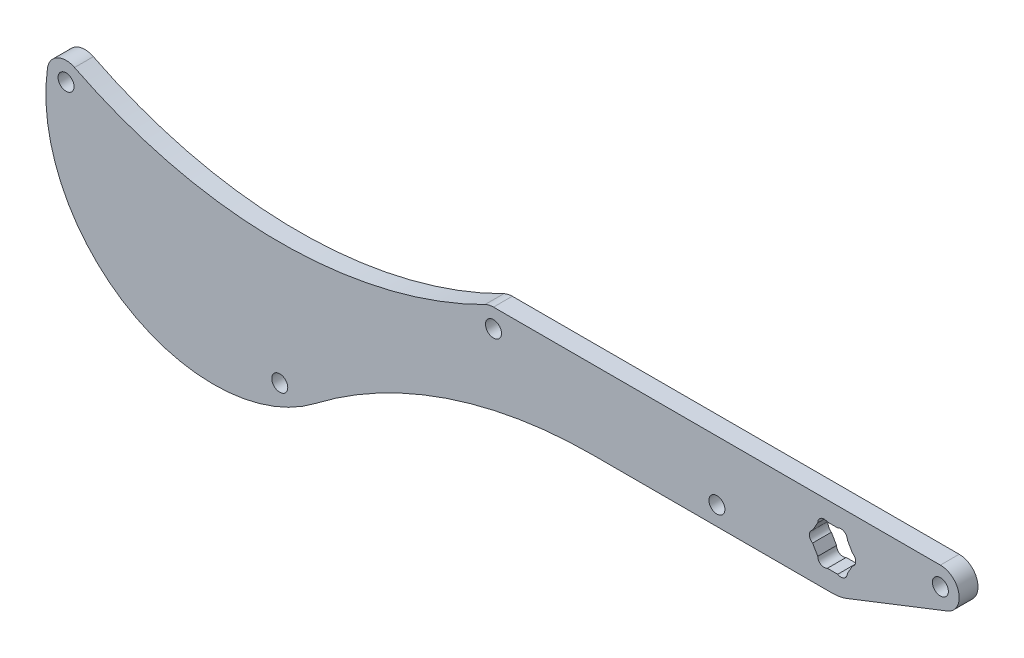
ISO-10303-21;
HEADER;
FILE_DESCRIPTION(('STEP AP214'),'2;1');
FILE_NAME('part.step','',(''),(''),'','','');
FILE_SCHEMA(('AUTOMOTIVE_DESIGN { 1 0 10303 214 1 1 1 1 }'));
ENDSEC;
DATA;
#1=APPLICATION_CONTEXT('core data for automotive mechanical design processes');
#2=APPLICATION_PROTOCOL_DEFINITION('international standard','automotive_design',2000,#1);
#3=PRODUCT_CONTEXT('',#1,'mechanical');
#4=PRODUCT('Part','Part','',(#3));
#5=PRODUCT_RELATED_PRODUCT_CATEGORY('part','',(#4));
#6=PRODUCT_DEFINITION_FORMATION('','',#4);
#7=PRODUCT_DEFINITION_CONTEXT('part definition',#1,'design');
#8=PRODUCT_DEFINITION('design','',#6,#7);
#9=PRODUCT_DEFINITION_SHAPE('','',#8);
#10=(LENGTH_UNIT() NAMED_UNIT(*) SI_UNIT(.MILLI.,.METRE.));
#11=(NAMED_UNIT(*) PLANE_ANGLE_UNIT() SI_UNIT($,.RADIAN.));
#12=(NAMED_UNIT(*) SI_UNIT($,.STERADIAN.) SOLID_ANGLE_UNIT());
#13=UNCERTAINTY_MEASURE_WITH_UNIT(LENGTH_MEASURE(1.E-05),#10,'distance_accuracy_value','');
#14=(GEOMETRIC_REPRESENTATION_CONTEXT(3) GLOBAL_UNCERTAINTY_ASSIGNED_CONTEXT((#13)) GLOBAL_UNIT_ASSIGNED_CONTEXT((#10,
#11,#12)) REPRESENTATION_CONTEXT('',''));
#15=CARTESIAN_POINT('',(0.,0.,0.));
#16=DIRECTION('',(0.,0.,1.));
#17=DIRECTION('',(1.,0.,0.));
#18=AXIS2_PLACEMENT_3D('',#15,#16,#17);
#19=CARTESIAN_POINT('',(231.79092816411,6.49999999999999,13.5));
#20=DIRECTION('',(0.,0.,1.));
#21=DIRECTION('',(1.,0.,0.));
#22=AXIS2_PLACEMENT_3D('',#19,#20,#21);
#23=CYLINDRICAL_SURFACE('',#22,5.99999999999998);
#24=CARTESIAN_POINT('',(231.79092816411,6.49999999999999,19.5));
#25=DIRECTION('',(0.,0.,1.));
#26=DIRECTION('',(1.,0.,0.));
#27=AXIS2_PLACEMENT_3D('',#24,#25,#26);
#28=CIRCLE('',#27,5.99999999999998);
#29=CARTESIAN_POINT('',(233.980730891528,0.913877551020409,19.5));
#30=VERTEX_POINT('',#29);
#31=CARTESIAN_POINT('',(231.79092816411,12.5,19.5));
#32=VERTEX_POINT('',#31);
#33=EDGE_CURVE('E320',#30,#32,#28,.T.);
#34=ORIENTED_EDGE('',*,*,#33,.F.);
#35=DIRECTION('',(0.,0.,1.));
#36=VECTOR('',#35,1.);
#37=CARTESIAN_POINT('',(233.980730891528,0.913877551020409,13.5));
#38=LINE('',#37,#36);
#39=CARTESIAN_POINT('',(233.980730891528,0.913877551020409,13.5));
#40=VERTEX_POINT('',#39);
#41=EDGE_CURVE('E42',#40,#30,#38,.T.);
#42=ORIENTED_EDGE('',*,*,#41,.F.);
#43=CARTESIAN_POINT('',(231.79092816411,6.49999999999999,13.5));
#44=DIRECTION('',(0.,0.,1.));
#45=DIRECTION('',(1.,0.,0.));
#46=AXIS2_PLACEMENT_3D('',#43,#44,#45);
#47=CIRCLE('',#46,5.99999999999998);
#48=CARTESIAN_POINT('',(231.79092816411,12.5,13.5));
#49=VERTEX_POINT('',#48);
#50=EDGE_CURVE('E344',#40,#49,#47,.T.);
#51=ORIENTED_EDGE('',*,*,#50,.T.);
#52=DIRECTION('',(0.,0.,1.));
#53=VECTOR('',#52,1.);
#54=CARTESIAN_POINT('',(231.79092816411,12.5,13.5));
#55=LINE('',#54,#53);
#56=EDGE_CURVE('E11',#49,#32,#55,.T.);
#57=ORIENTED_EDGE('',*,*,#56,.T.);
#58=EDGE_LOOP('',(#34,#42,#51,#57));
#59=FACE_BOUND('',#58,.T.);
#60=ADVANCED_FACE('F33',(#59),#23,.T.);
#61=CARTESIAN_POINT('',(201.961884601529,-11.6377551020408,13.5));
#62=DIRECTION('',(0.364967121236293,-0.931020408163265,0.));
#63=DIRECTION('',(0.931020408163265,0.364967121236293,0.));
#64=AXIS2_PLACEMENT_3D('',#61,#62,#63);
#65=PLANE('',#64);
#66=DIRECTION('',(0.931020408163265,0.364967121236293,0.));
#67=VECTOR('',#66,1.);
#68=CARTESIAN_POINT('',(201.961884601529,-11.6377551020408,19.5));
#69=LINE('',#68,#67);
#70=CARTESIAN_POINT('',(201.961884601529,-11.6377551020408,19.5));
#71=VERTEX_POINT('',#70);
#72=EDGE_CURVE('E370',#71,#30,#69,.T.);
#73=ORIENTED_EDGE('',*,*,#72,.F.);
#74=DIRECTION('',(0.,0.,1.));
#75=VECTOR('',#74,1.);
#76=CARTESIAN_POINT('',(201.961884601529,-11.6377551020408,13.5));
#77=LINE('',#76,#75);
#78=CARTESIAN_POINT('',(201.961884601529,-11.6377551020408,13.5));
#79=VERTEX_POINT('',#78);
#80=EDGE_CURVE('E376',#79,#71,#77,.T.);
#81=ORIENTED_EDGE('',*,*,#80,.F.);
#82=DIRECTION('',(0.931020408163265,0.364967121236293,0.));
#83=VECTOR('',#82,1.);
#84=CARTESIAN_POINT('',(201.961884601529,-11.6377551020408,13.5));
#85=LINE('',#84,#83);
#86=EDGE_CURVE('E341',#79,#40,#85,.T.);
#87=ORIENTED_EDGE('',*,*,#86,.T.);
#88=ORIENTED_EDGE('',*,*,#41,.T.);
#89=EDGE_LOOP('',(#73,#81,#87,#88));
#90=FACE_BOUND('',#89,.T.);
#91=ADVANCED_FACE('F428',(#90),#65,.T.);
#92=CARTESIAN_POINT('',(197.399795586075,0.,13.5));
#93=DIRECTION('',(0.,0.,1.));
#94=DIRECTION('',(1.,0.,0.));
#95=AXIS2_PLACEMENT_3D('',#92,#93,#94);
#96=CYLINDRICAL_SURFACE('',#95,12.5);
#97=CARTESIAN_POINT('',(197.399795586075,0.,19.5));
#98=DIRECTION('',(0.,0.,1.));
#99=DIRECTION('',(1.,0.,0.));
#100=AXIS2_PLACEMENT_3D('',#97,#98,#99);
#101=CIRCLE('',#100,12.5);
#102=CARTESIAN_POINT('',(197.399795586075,-12.5,19.5));
#103=VERTEX_POINT('',#102);
#104=EDGE_CURVE('E367',#103,#71,#101,.T.);
#105=ORIENTED_EDGE('',*,*,#104,.F.);
#106=DIRECTION('',(0.,0.,1.));
#107=VECTOR('',#106,1.);
#108=CARTESIAN_POINT('',(197.399795586075,-12.5,13.5));
#109=LINE('',#108,#107);
#110=CARTESIAN_POINT('',(197.399795586075,-12.5,13.5));
#111=VERTEX_POINT('',#110);
#112=EDGE_CURVE('E378',#111,#103,#109,.T.);
#113=ORIENTED_EDGE('',*,*,#112,.F.);
#114=CARTESIAN_POINT('',(197.399795586075,0.,13.5));
#115=DIRECTION('',(0.,0.,1.));
#116=DIRECTION('',(1.,0.,0.));
#117=AXIS2_PLACEMENT_3D('',#114,#115,#116);
#118=CIRCLE('',#117,12.5);
#119=EDGE_CURVE('E338',#111,#79,#118,.T.);
#120=ORIENTED_EDGE('',*,*,#119,.T.);
#121=ORIENTED_EDGE('',*,*,#80,.T.);
#122=EDGE_LOOP('',(#105,#113,#120,#121));
#123=FACE_BOUND('',#122,.T.);
#124=ADVANCED_FACE('F426',(#123),#96,.T.);
#125=CARTESIAN_POINT('',(120.978886955537,-12.5,13.5));
#126=DIRECTION('',(0.,-1.,0.));
#127=DIRECTION('',(1.,0.,0.));
#128=AXIS2_PLACEMENT_3D('',#125,#126,#127);
#129=PLANE('',#128);
#130=DIRECTION('',(1.,0.,0.));
#131=VECTOR('',#130,1.);
#132=CARTESIAN_POINT('',(120.978886955537,-12.5,19.5));
#133=LINE('',#132,#131);
#134=CARTESIAN_POINT('',(120.978886955537,-12.5,19.5));
#135=VERTEX_POINT('',#134);
#136=EDGE_CURVE('E364',#135,#103,#133,.T.);
#137=ORIENTED_EDGE('',*,*,#136,.F.);
#138=DIRECTION('',(0.,0.,1.));
#139=VECTOR('',#138,1.);
#140=CARTESIAN_POINT('',(120.978886955537,-12.5,13.5));
#141=LINE('',#140,#139);
#142=CARTESIAN_POINT('',(120.978886955537,-12.5,13.5));
#143=VERTEX_POINT('',#142);
#144=EDGE_CURVE('E380',#143,#135,#141,.T.);
#145=ORIENTED_EDGE('',*,*,#144,.F.);
#146=DIRECTION('',(1.,0.,0.));
#147=VECTOR('',#146,1.);
#148=CARTESIAN_POINT('',(120.978886955537,-12.5,13.5));
#149=LINE('',#148,#147);
#150=EDGE_CURVE('E335',#143,#111,#149,.T.);
#151=ORIENTED_EDGE('',*,*,#150,.T.);
#152=ORIENTED_EDGE('',*,*,#112,.T.);
#153=EDGE_LOOP('',(#137,#145,#151,#152));
#154=FACE_BOUND('',#153,.T.);
#155=ADVANCED_FACE('F422',(#154),#129,.T.);
#156=CARTESIAN_POINT('',(120.978886955537,-157.986476695129,13.5));
#157=DIRECTION('',(0.,0.,1.));
#158=DIRECTION('',(1.,0.,0.));
#159=AXIS2_PLACEMENT_3D('',#156,#157,#158);
#160=CYLINDRICAL_SURFACE('',#159,145.486476695129);
#161=CARTESIAN_POINT('',(120.978886955537,-157.986476695129,19.5));
#162=DIRECTION('',(0.,0.,-1.));
#163=DIRECTION('',(1.,0.,0.));
#164=AXIS2_PLACEMENT_3D('',#161,#162,#163);
#165=CIRCLE('',#164,145.486476695129);
#166=CARTESIAN_POINT('',(32.5266850271321,-42.4766378277017,19.5));
#167=VERTEX_POINT('',#166);
#168=EDGE_CURVE('E361',#167,#135,#165,.T.);
#169=ORIENTED_EDGE('',*,*,#168,.F.);
#170=DIRECTION('',(0.,0.,1.));
#171=VECTOR('',#170,1.);
#172=CARTESIAN_POINT('',(32.5266850271321,-42.4766378277017,13.5));
#173=LINE('',#172,#171);
#174=CARTESIAN_POINT('',(32.5266850271321,-42.4766378277017,13.5));
#175=VERTEX_POINT('',#174);
#176=EDGE_CURVE('E382',#175,#167,#173,.T.);
#177=ORIENTED_EDGE('',*,*,#176,.F.);
#178=CARTESIAN_POINT('',(120.978886955537,-157.986476695129,13.5));
#179=DIRECTION('',(0.,0.,-1.));
#180=DIRECTION('',(1.,0.,0.));
#181=AXIS2_PLACEMENT_3D('',#178,#179,#180);
#182=CIRCLE('',#181,145.486476695129);
#183=EDGE_CURVE('E332',#175,#143,#182,.T.);
#184=ORIENTED_EDGE('',*,*,#183,.T.);
#185=ORIENTED_EDGE('',*,*,#144,.T.);
#186=EDGE_LOOP('',(#169,#177,#184,#185));
#187=FACE_BOUND('',#186,.T.);
#188=ADVANCED_FACE('F418',(#187),#160,.F.);
#189=CARTESIAN_POINT('',(0.,0.,13.5));
#190=DIRECTION('',(0.,0.,1.));
#191=DIRECTION('',(1.,0.,0.));
#192=AXIS2_PLACEMENT_3D('',#189,#190,#191);
#193=CYLINDRICAL_SURFACE('',#192,53.5);
#194=CARTESIAN_POINT('',(0.,0.,19.5));
#195=DIRECTION('',(0.,0.,1.));
#196=DIRECTION('',(1.,0.,0.));
#197=AXIS2_PLACEMENT_3D('',#194,#195,#196);
#198=CIRCLE('',#197,53.5);
#199=CARTESIAN_POINT('',(-52.996718656589,7.32105263157895,19.5));
#200=VERTEX_POINT('',#199);
#201=EDGE_CURVE('E358',#200,#167,#198,.T.);
#202=ORIENTED_EDGE('',*,*,#201,.F.);
#203=DIRECTION('',(0.,0.,1.));
#204=VECTOR('',#203,1.);
#205=CARTESIAN_POINT('',(-52.996718656589,7.32105263157895,13.5));
#206=LINE('',#205,#204);
#207=CARTESIAN_POINT('',(-52.996718656589,7.32105263157895,13.5));
#208=VERTEX_POINT('',#207);
#209=EDGE_CURVE('E384',#208,#200,#206,.T.);
#210=ORIENTED_EDGE('',*,*,#209,.F.);
#211=CARTESIAN_POINT('',(0.,0.,13.5));
#212=DIRECTION('',(0.,0.,1.));
#213=DIRECTION('',(1.,0.,0.));
#214=AXIS2_PLACEMENT_3D('',#211,#212,#213);
#215=CIRCLE('',#214,53.5);
#216=EDGE_CURVE('E329',#208,#175,#215,.T.);
#217=ORIENTED_EDGE('',*,*,#216,.T.);
#218=ORIENTED_EDGE('',*,*,#176,.T.);
#219=EDGE_LOOP('',(#202,#210,#217,#218));
#220=FACE_BOUND('',#219,.T.);
#221=ADVANCED_FACE('F414',(#220),#193,.T.);
#222=CARTESIAN_POINT('',(-47.0531614240743,6.50000000000001,13.5));
#223=DIRECTION('',(0.,0.,1.));
#224=DIRECTION('',(1.,0.,0.));
#225=AXIS2_PLACEMENT_3D('',#222,#223,#224);
#226=CYLINDRICAL_SURFACE('',#225,5.99999999999999);
#227=CARTESIAN_POINT('',(-47.0531614240743,6.50000000000001,19.5));
#228=DIRECTION('',(0.,0.,1.));
#229=DIRECTION('',(1.,0.,0.));
#230=AXIS2_PLACEMENT_3D('',#227,#228,#229);
#231=CIRCLE('',#230,5.99999999999999);
#232=CARTESIAN_POINT('',(-44.3535775638708,11.8583810037854,19.5));
#233=VERTEX_POINT('',#232);
#234=EDGE_CURVE('E355',#233,#200,#231,.T.);
#235=ORIENTED_EDGE('',*,*,#234,.F.);
#236=DIRECTION('',(0.,0.,1.));
#237=VECTOR('',#236,1.);
#238=CARTESIAN_POINT('',(-44.3535775638708,11.8583810037854,13.5));
#239=LINE('',#238,#237);
#240=CARTESIAN_POINT('',(-44.3535775638708,11.8583810037854,13.5));
#241=VERTEX_POINT('',#240);
#242=EDGE_CURVE('E386',#241,#233,#239,.T.);
#243=ORIENTED_EDGE('',*,*,#242,.F.);
#244=CARTESIAN_POINT('',(-47.0531614240743,6.50000000000001,13.5));
#245=DIRECTION('',(0.,0.,1.));
#246=DIRECTION('',(1.,0.,0.));
#247=AXIS2_PLACEMENT_3D('',#244,#245,#246);
#248=CIRCLE('',#247,5.99999999999999);
#249=EDGE_CURVE('E326',#241,#208,#248,.T.);
#250=ORIENTED_EDGE('',*,*,#249,.T.);
#251=ORIENTED_EDGE('',*,*,#209,.T.);
#252=EDGE_LOOP('',(#235,#243,#250,#251));
#253=FACE_BOUND('',#252,.T.);
#254=ADVANCED_FACE('F412',(#253),#226,.T.);
#255=CARTESIAN_POINT('',(21.1052464968056,141.787043175593,13.5));
#256=DIRECTION('',(0.,0.,1.));
#257=DIRECTION('',(1.,0.,0.));
#258=AXIS2_PLACEMENT_3D('',#255,#256,#257);
#259=CYLINDRICAL_SURFACE('',#258,145.486476695129);
#260=CARTESIAN_POINT('',(21.1052464968056,141.787043175593,19.5));
#261=DIRECTION('',(0.,0.,-1.));
#262=DIRECTION('',(1.,0.,0.));
#263=AXIS2_PLACEMENT_3D('',#260,#261,#262);
#264=CIRCLE('',#263,145.486476695129);
#265=CARTESIAN_POINT('',(86.564070557482,11.8583810037854,19.5));
#266=VERTEX_POINT('',#265);
#267=EDGE_CURVE('E352',#266,#233,#264,.T.);
#268=ORIENTED_EDGE('',*,*,#267,.F.);
#269=DIRECTION('',(0.,0.,1.));
#270=VECTOR('',#269,1.);
#271=CARTESIAN_POINT('',(86.564070557482,11.8583810037854,13.5));
#272=LINE('',#271,#270);
#273=CARTESIAN_POINT('',(86.564070557482,11.8583810037854,13.5));
#274=VERTEX_POINT('',#273);
#275=EDGE_CURVE('E387',#274,#266,#272,.T.);
#276=ORIENTED_EDGE('',*,*,#275,.F.);
#277=CARTESIAN_POINT('',(21.1052464968056,141.787043175593,13.5));
#278=DIRECTION('',(0.,0.,-1.));
#279=DIRECTION('',(1.,0.,0.));
#280=AXIS2_PLACEMENT_3D('',#277,#278,#279);
#281=CIRCLE('',#280,145.486476695129);
#282=EDGE_CURVE('E323',#274,#241,#281,.T.);
#283=ORIENTED_EDGE('',*,*,#282,.T.);
#284=ORIENTED_EDGE('',*,*,#242,.T.);
#285=EDGE_LOOP('',(#268,#276,#283,#284));
#286=FACE_BOUND('',#285,.T.);
#287=ADVANCED_FACE('F408',(#286),#259,.F.);
#288=CARTESIAN_POINT('',(89.2636544176856,6.5,13.5));
#289=DIRECTION('',(0.,0.,1.));
#290=DIRECTION('',(1.,0.,0.));
#291=AXIS2_PLACEMENT_3D('',#288,#289,#290);
#292=CYLINDRICAL_SURFACE('',#291,5.99999999999999);
#293=CARTESIAN_POINT('',(89.2636544176856,6.5,19.5));
#294=DIRECTION('',(0.,0.,1.));
#295=DIRECTION('',(1.,0.,0.));
#296=AXIS2_PLACEMENT_3D('',#293,#294,#295);
#297=CIRCLE('',#296,5.99999999999999);
#298=CARTESIAN_POINT('',(89.2636544176856,12.5,19.5));
#299=VERTEX_POINT('',#298);
#300=EDGE_CURVE('E349',#299,#266,#297,.T.);
#301=ORIENTED_EDGE('',*,*,#300,.F.);
#302=DIRECTION('',(0.,0.,1.));
#303=VECTOR('',#302,1.);
#304=CARTESIAN_POINT('',(89.2636544176856,12.5,13.5));
#305=LINE('',#304,#303);
#306=CARTESIAN_POINT('',(89.2636544176856,12.5,13.5));
#307=VERTEX_POINT('',#306);
#308=EDGE_CURVE('E37',#307,#299,#305,.T.);
#309=ORIENTED_EDGE('',*,*,#308,.F.);
#310=CARTESIAN_POINT('',(89.2636544176856,6.5,13.5));
#311=DIRECTION('',(0.,0.,1.));
#312=DIRECTION('',(1.,0.,0.));
#313=AXIS2_PLACEMENT_3D('',#310,#311,#312);
#314=CIRCLE('',#313,5.99999999999999);
#315=EDGE_CURVE('E319',#307,#274,#314,.T.);
#316=ORIENTED_EDGE('',*,*,#315,.T.);
#317=ORIENTED_EDGE('',*,*,#275,.T.);
#318=EDGE_LOOP('',(#301,#309,#316,#317));
#319=FACE_BOUND('',#318,.T.);
#320=ADVANCED_FACE('F395',(#319),#292,.T.);
#321=CARTESIAN_POINT('',(197.399795586075,12.5,13.5));
#322=DIRECTION('',(0.,1.,0.));
#323=DIRECTION('',(-1.,0.,0.));
#324=AXIS2_PLACEMENT_3D('',#321,#322,#323);
#325=PLANE('',#324);
#326=DIRECTION('',(-1.,0.,0.));
#327=VECTOR('',#326,1.);
#328=CARTESIAN_POINT('',(197.399795586075,12.5,19.5));
#329=LINE('',#328,#327);
#330=EDGE_CURVE('E314',#32,#299,#329,.T.);
#331=ORIENTED_EDGE('',*,*,#330,.F.);
#332=ORIENTED_EDGE('',*,*,#56,.F.);
#333=DIRECTION('',(-1.,0.,0.));
#334=VECTOR('',#333,1.);
#335=CARTESIAN_POINT('',(231.79092816411,12.5,13.5));
#336=LINE('',#335,#334);
#337=EDGE_CURVE('E317',#49,#307,#336,.T.);
#338=ORIENTED_EDGE('',*,*,#337,.T.);
#339=ORIENTED_EDGE('',*,*,#308,.T.);
#340=EDGE_LOOP('',(#331,#332,#338,#339));
#341=FACE_BOUND('',#340,.T.);
#342=ADVANCED_FACE('F35',(#341),#325,.T.);
#343=CARTESIAN_POINT('',(89.2636544176856,6.5,13.5));
#344=DIRECTION('',(0.,0.,1.));
#345=DIRECTION('',(1.,0.,0.));
#346=AXIS2_PLACEMENT_3D('',#343,#344,#345);
#347=PLANE('',#346);
#348=DIRECTION('',(-0.500000000000005,-0.866025403784436,0.));
#349=VECTOR('',#348,1.);
#350=CARTESIAN_POINT('',(167.637780272056,-38.7493226595231,13.5));
#351=LINE('',#350,#349);
#352=CARTESIAN_POINT('',(192.679753863261,4.62464792224193,13.5));
#353=VERTEX_POINT('',#352);
#354=CARTESIAN_POINT('',(191.034712140448,1.77535207775812,13.5));
#355=VERTEX_POINT('',#354);
#356=EDGE_CURVE('E280',#353,#355,#351,.T.);
#357=ORIENTED_EDGE('',*,*,#356,.T.);
#358=CARTESIAN_POINT('',(192.059712140448,0.,13.5));
#359=DIRECTION('',(0.,0.,1.));
#360=DIRECTION('',(1.,0.,0.));
#361=AXIS2_PLACEMENT_3D('',#358,#359,#360);
#362=CIRCLE('',#361,2.05000000000001);
#363=CARTESIAN_POINT('',(191.034712140448,-1.77535207775808,13.5));
#364=VERTEX_POINT('',#363);
#365=EDGE_CURVE('E283',#355,#364,#362,.T.);
#366=ORIENTED_EDGE('',*,*,#365,.T.);
#367=DIRECTION('',(0.499999999999992,-0.866025403784443,0.));
#368=VECTOR('',#367,1.);
#369=CARTESIAN_POINT('',(162.008615147459,48.4993226595223,13.5));
#370=LINE('',#369,#368);
#371=CARTESIAN_POINT('',(192.679753863261,-4.62464792224183,13.5));
#372=VERTEX_POINT('',#371);
#373=EDGE_CURVE('E235',#364,#372,#370,.T.);
#374=ORIENTED_EDGE('',*,*,#373,.T.);
#375=CARTESIAN_POINT('',(194.729753863261,-4.62464792224187,13.5));
#376=DIRECTION('',(0.,0.,1.));
#377=DIRECTION('',(1.,0.,0.));
#378=AXIS2_PLACEMENT_3D('',#375,#376,#377);
#379=CIRCLE('',#378,2.04999999999999);
#380=CARTESIAN_POINT('',(195.754753863261,-6.4,13.5));
#381=VERTEX_POINT('',#380);
#382=EDGE_CURVE('E190',#372,#381,#379,.T.);
#383=ORIENTED_EDGE('',*,*,#382,.T.);
#384=DIRECTION('',(1.,0.,0.));
#385=VECTOR('',#384,1.);
#386=CARTESIAN_POINT('',(89.2636544176855,-6.39999999999879,13.5));
#387=LINE('',#386,#385);
#388=CARTESIAN_POINT('',(199.044837308888,-6.4,13.5));
#389=VERTEX_POINT('',#388);
#390=EDGE_CURVE('E256',#381,#389,#387,.T.);
#391=ORIENTED_EDGE('',*,*,#390,.T.);
#392=CARTESIAN_POINT('',(200.069837308888,-4.62464792224195,13.5));
#393=DIRECTION('',(0.,0.,1.));
#394=DIRECTION('',(1.,0.,0.));
#395=AXIS2_PLACEMENT_3D('',#392,#393,#394);
#396=CIRCLE('',#395,2.04999999999996);
#397=CARTESIAN_POINT('',(202.119837308888,-4.62464792224201,13.5));
#398=VERTEX_POINT('',#397);
#399=EDGE_CURVE('E259',#389,#398,#396,.T.);
#400=ORIENTED_EDGE('',*,*,#399,.T.);
#401=DIRECTION('',(0.500000000000029,0.866025403784422,0.));
#402=VECTOR('',#401,1.);
#403=CARTESIAN_POINT('',(178.722905440494,-45.1493226595248,13.5));
#404=LINE('',#403,#402);
#405=CARTESIAN_POINT('',(203.764879031702,-1.77535207775816,13.5));
#406=VERTEX_POINT('',#405);
#407=EDGE_CURVE('E262',#398,#406,#404,.T.);
#408=ORIENTED_EDGE('',*,*,#407,.T.);
#409=CARTESIAN_POINT('',(202.739879031702,0.,13.5));
#410=DIRECTION('',(0.,0.,1.));
#411=DIRECTION('',(1.,0.,0.));
#412=AXIS2_PLACEMENT_3D('',#409,#410,#411);
#413=CIRCLE('',#412,2.04999999999997);
#414=CARTESIAN_POINT('',(203.764879031702,1.77535207775795,13.5));
#415=VERTEX_POINT('',#414);
#416=EDGE_CURVE('E265',#406,#415,#413,.T.);
#417=ORIENTED_EDGE('',*,*,#416,.T.);
#418=DIRECTION('',(-0.499999999999968,0.866025403784457,0.));
#419=VECTOR('',#418,1.);
#420=CARTESIAN_POINT('',(173.093740315902,54.8993226595207,13.5));
#421=LINE('',#420,#419);
#422=CARTESIAN_POINT('',(202.119837308889,4.62464792224184,13.5));
#423=VERTEX_POINT('',#422);
#424=EDGE_CURVE('E268',#415,#423,#421,.T.);
#425=ORIENTED_EDGE('',*,*,#424,.T.);
#426=CARTESIAN_POINT('',(200.069837308889,4.62464792224186,13.5));
#427=DIRECTION('',(0.,0.,1.));
#428=DIRECTION('',(1.,0.,0.));
#429=AXIS2_PLACEMENT_3D('',#426,#427,#428);
#430=CIRCLE('',#429,2.04999999999998);
#431=CARTESIAN_POINT('',(199.044837308889,6.39999999999992,13.5));
#432=VERTEX_POINT('',#431);
#433=EDGE_CURVE('E271',#423,#432,#430,.T.);
#434=ORIENTED_EDGE('',*,*,#433,.T.);
#435=DIRECTION('',(-1.,0.,0.));
#436=VECTOR('',#435,1.);
#437=CARTESIAN_POINT('',(89.2636544176856,6.40000000000281,13.5));
#438=LINE('',#437,#436);
#439=CARTESIAN_POINT('',(195.754753863261,6.4,13.5));
#440=VERTEX_POINT('',#439);
#441=EDGE_CURVE('E274',#432,#440,#438,.T.);
#442=ORIENTED_EDGE('',*,*,#441,.T.);
#443=CARTESIAN_POINT('',(194.729753863261,4.62464792224191,13.5));
#444=DIRECTION('',(0.,0.,1.));
#445=DIRECTION('',(1.,0.,0.));
#446=AXIS2_PLACEMENT_3D('',#443,#444,#445);
#447=CIRCLE('',#446,2.05);
#448=EDGE_CURVE('E277',#440,#353,#447,.T.);
#449=ORIENTED_EDGE('',*,*,#448,.T.);
#450=EDGE_LOOP('',(#357,#366,#374,#383,#391,#400,#408,#417,#425,#434,#442,#449));
#451=FACE_BOUND('',#450,.T.);
#452=CARTESIAN_POINT('',(231.79092816411,6.49999999999999,13.5));
#453=DIRECTION('',(0.,0.,1.));
#454=DIRECTION('',(1.,0.,0.));
#455=AXIS2_PLACEMENT_3D('',#452,#453,#454);
#456=CIRCLE('',#455,2.54999999315468);
#457=CARTESIAN_POINT('',(234.340928157265,6.49999999999999,13.5));
#458=VERTEX_POINT('',#457);
#459=EDGE_CURVE('E287',#458,#458,#456,.T.);
#460=ORIENTED_EDGE('',*,*,#459,.T.);
#461=EDGE_LOOP('',(#460));
#462=FACE_BOUND('',#461,.T.);
#463=CARTESIAN_POINT('',(-47.0531614240743,6.50000000000001,13.5));
#464=DIRECTION('',(0.,0.,1.));
#465=DIRECTION('',(1.,0.,0.));
#466=AXIS2_PLACEMENT_3D('',#463,#464,#465);
#467=CIRCLE('',#466,2.55);
#468=CARTESIAN_POINT('',(-44.5031614240743,6.50000000000001,13.5));
#469=VERTEX_POINT('',#468);
#470=EDGE_CURVE('E293',#469,#469,#467,.T.);
#471=ORIENTED_EDGE('',*,*,#470,.T.);
#472=EDGE_LOOP('',(#471));
#473=FACE_BOUND('',#472,.T.);
#474=CARTESIAN_POINT('',(21.1052464968056,-42.5537139426052,13.5));
#475=DIRECTION('',(0.,0.,1.));
#476=DIRECTION('',(1.,0.,0.));
#477=AXIS2_PLACEMENT_3D('',#474,#475,#476);
#478=CIRCLE('',#477,2.54999999315467);
#479=CARTESIAN_POINT('',(23.6552464899603,-42.5537139426052,13.5));
#480=VERTEX_POINT('',#479);
#481=EDGE_CURVE('E299',#480,#480,#478,.T.);
#482=ORIENTED_EDGE('',*,*,#481,.T.);
#483=EDGE_LOOP('',(#482));
#484=FACE_BOUND('',#483,.T.);
#485=CARTESIAN_POINT('',(89.2636544176856,6.5,13.5));
#486=DIRECTION('',(0.,0.,1.));
#487=DIRECTION('',(1.,0.,0.));
#488=AXIS2_PLACEMENT_3D('',#485,#486,#487);
#489=CIRCLE('',#488,2.54999999315466);
#490=CARTESIAN_POINT('',(91.8136544108403,6.5,13.5));
#491=VERTEX_POINT('',#490);
#492=EDGE_CURVE('E305',#491,#491,#489,.T.);
#493=ORIENTED_EDGE('',*,*,#492,.T.);
#494=EDGE_LOOP('',(#493));
#495=FACE_BOUND('',#494,.T.);
#496=CARTESIAN_POINT('',(160.527291290898,-6.5,13.5));
#497=DIRECTION('',(0.,0.,1.));
#498=DIRECTION('',(1.,0.,0.));
#499=AXIS2_PLACEMENT_3D('',#496,#497,#498);
#500=CIRCLE('',#499,2.54999999315468);
#501=CARTESIAN_POINT('',(163.077291284053,-6.5,13.5));
#502=VERTEX_POINT('',#501);
#503=EDGE_CURVE('E311',#502,#502,#500,.T.);
#504=ORIENTED_EDGE('',*,*,#503,.T.);
#505=EDGE_LOOP('',(#504));
#506=FACE_BOUND('',#505,.T.);
#507=ORIENTED_EDGE('',*,*,#337,.F.);
#508=ORIENTED_EDGE('',*,*,#50,.F.);
#509=ORIENTED_EDGE('',*,*,#86,.F.);
#510=ORIENTED_EDGE('',*,*,#119,.F.);
#511=ORIENTED_EDGE('',*,*,#150,.F.);
#512=ORIENTED_EDGE('',*,*,#183,.F.);
#513=ORIENTED_EDGE('',*,*,#216,.F.);
#514=ORIENTED_EDGE('',*,*,#249,.F.);
#515=ORIENTED_EDGE('',*,*,#282,.F.);
#516=ORIENTED_EDGE('',*,*,#315,.F.);
#517=EDGE_LOOP('',(#507,#508,#509,#510,#511,#512,#513,#514,#515,#516));
#518=FACE_BOUND('',#517,.T.);
#519=ADVANCED_FACE('F402',(#451,#462,#473,#484,#495,#506,#518),#347,.F.);
#520=CARTESIAN_POINT('',(89.2636544176856,6.5,19.5));
#521=DIRECTION('',(0.,0.,1.));
#522=DIRECTION('',(1.,0.,0.));
#523=AXIS2_PLACEMENT_3D('',#520,#521,#522);
#524=PLANE('',#523);
#525=CARTESIAN_POINT('',(192.059712140448,0.,19.5));
#526=DIRECTION('',(0.,0.,1.));
#527=DIRECTION('',(1.,0.,0.));
#528=AXIS2_PLACEMENT_3D('',#525,#526,#527);
#529=CIRCLE('',#528,2.05000000000001);
#530=CARTESIAN_POINT('',(191.034712140448,1.77535207775812,19.5));
#531=VERTEX_POINT('',#530);
#532=CARTESIAN_POINT('',(191.034712140448,-1.77535207775808,19.5));
#533=VERTEX_POINT('',#532);
#534=EDGE_CURVE('E58',#531,#533,#529,.T.);
#535=ORIENTED_EDGE('',*,*,#534,.F.);
#536=DIRECTION('',(-0.500000000000005,-0.866025403784436,0.));
#537=VECTOR('',#536,1.);
#538=CARTESIAN_POINT('',(191.034712140448,1.77535207775812,19.5));
#539=LINE('',#538,#537);
#540=CARTESIAN_POINT('',(192.679753863261,4.62464792224193,19.5));
#541=VERTEX_POINT('',#540);
#542=EDGE_CURVE('E230',#541,#531,#539,.T.);
#543=ORIENTED_EDGE('',*,*,#542,.F.);
#544=CARTESIAN_POINT('',(194.729753863261,4.62464792224191,19.5));
#545=DIRECTION('',(0.,0.,1.));
#546=DIRECTION('',(1.,0.,0.));
#547=AXIS2_PLACEMENT_3D('',#544,#545,#546);
#548=CIRCLE('',#547,2.05);
#549=CARTESIAN_POINT('',(195.754753863261,6.4,19.5));
#550=VERTEX_POINT('',#549);
#551=EDGE_CURVE('E227',#550,#541,#548,.T.);
#552=ORIENTED_EDGE('',*,*,#551,.F.);
#553=DIRECTION('',(-1.,0.,0.));
#554=VECTOR('',#553,1.);
#555=CARTESIAN_POINT('',(195.754753863261,6.4,19.5));
#556=LINE('',#555,#554);
#557=CARTESIAN_POINT('',(199.044837308889,6.39999999999992,19.5));
#558=VERTEX_POINT('',#557);
#559=EDGE_CURVE('E224',#558,#550,#556,.T.);
#560=ORIENTED_EDGE('',*,*,#559,.F.);
#561=CARTESIAN_POINT('',(200.069837308889,4.62464792224186,19.5));
#562=DIRECTION('',(0.,0.,1.));
#563=DIRECTION('',(1.,0.,0.));
#564=AXIS2_PLACEMENT_3D('',#561,#562,#563);
#565=CIRCLE('',#564,2.04999999999998);
#566=CARTESIAN_POINT('',(202.119837308889,4.62464792224184,19.5));
#567=VERTEX_POINT('',#566);
#568=EDGE_CURVE('E221',#567,#558,#565,.T.);
#569=ORIENTED_EDGE('',*,*,#568,.F.);
#570=DIRECTION('',(-0.499999999999968,0.866025403784457,0.));
#571=VECTOR('',#570,1.);
#572=CARTESIAN_POINT('',(202.119837308889,4.62464792224184,19.5));
#573=LINE('',#572,#571);
#574=CARTESIAN_POINT('',(203.764879031702,1.77535207775795,19.5));
#575=VERTEX_POINT('',#574);
#576=EDGE_CURVE('E218',#575,#567,#573,.T.);
#577=ORIENTED_EDGE('',*,*,#576,.F.);
#578=CARTESIAN_POINT('',(202.739879031702,0.,19.5));
#579=DIRECTION('',(0.,0.,1.));
#580=DIRECTION('',(1.,0.,0.));
#581=AXIS2_PLACEMENT_3D('',#578,#579,#580);
#582=CIRCLE('',#581,2.04999999999997);
#583=CARTESIAN_POINT('',(203.764879031702,-1.77535207775816,19.5));
#584=VERTEX_POINT('',#583);
#585=EDGE_CURVE('E215',#584,#575,#582,.T.);
#586=ORIENTED_EDGE('',*,*,#585,.F.);
#587=DIRECTION('',(0.500000000000029,0.866025403784422,0.));
#588=VECTOR('',#587,1.);
#589=CARTESIAN_POINT('',(203.764879031702,-1.77535207775819,19.5));
#590=LINE('',#589,#588);
#591=CARTESIAN_POINT('',(202.119837308888,-4.62464792224201,19.5));
#592=VERTEX_POINT('',#591);
#593=EDGE_CURVE('E212',#592,#584,#590,.T.);
#594=ORIENTED_EDGE('',*,*,#593,.F.);
#595=CARTESIAN_POINT('',(200.069837308888,-4.62464792224195,19.5));
#596=DIRECTION('',(0.,0.,1.));
#597=DIRECTION('',(1.,0.,0.));
#598=AXIS2_PLACEMENT_3D('',#595,#596,#597);
#599=CIRCLE('',#598,2.04999999999996);
#600=CARTESIAN_POINT('',(199.044837308888,-6.4,19.5));
#601=VERTEX_POINT('',#600);
#602=EDGE_CURVE('E206',#601,#592,#599,.T.);
#603=ORIENTED_EDGE('',*,*,#602,.F.);
#604=DIRECTION('',(1.,0.,0.));
#605=VECTOR('',#604,1.);
#606=CARTESIAN_POINT('',(199.044837308888,-6.40000000000004,19.5));
#607=LINE('',#606,#605);
#608=CARTESIAN_POINT('',(195.754753863261,-6.4,19.5));
#609=VERTEX_POINT('',#608);
#610=EDGE_CURVE('E204',#609,#601,#607,.T.);
#611=ORIENTED_EDGE('',*,*,#610,.F.);
#612=CARTESIAN_POINT('',(194.729753863261,-4.62464792224187,19.5));
#613=DIRECTION('',(0.,0.,1.));
#614=DIRECTION('',(1.,0.,0.));
#615=AXIS2_PLACEMENT_3D('',#612,#613,#614);
#616=CIRCLE('',#615,2.04999999999999);
#617=CARTESIAN_POINT('',(192.679753863261,-4.62464792224183,19.5));
#618=VERTEX_POINT('',#617);
#619=EDGE_CURVE('E187',#618,#609,#616,.T.);
#620=ORIENTED_EDGE('',*,*,#619,.F.);
#621=DIRECTION('',(0.499999999999992,-0.866025403784443,0.));
#622=VECTOR('',#621,1.);
#623=CARTESIAN_POINT('',(192.679753863261,-4.62464792224183,19.5));
#624=LINE('',#623,#622);
#625=EDGE_CURVE('E196',#533,#618,#624,.T.);
#626=ORIENTED_EDGE('',*,*,#625,.F.);
#627=EDGE_LOOP('',(#535,#543,#552,#560,#569,#577,#586,#594,#603,#611,#620,#626));
#628=FACE_BOUND('',#627,.T.);
#629=CARTESIAN_POINT('',(231.79092816411,6.49999999999999,19.5));
#630=DIRECTION('',(0.,0.,1.));
#631=DIRECTION('',(1.,0.,0.));
#632=AXIS2_PLACEMENT_3D('',#629,#630,#631);
#633=CIRCLE('',#632,2.54999999315468);
#634=CARTESIAN_POINT('',(234.340928157265,6.49999999999999,19.5));
#635=VERTEX_POINT('',#634);
#636=EDGE_CURVE('E286',#635,#635,#633,.T.);
#637=ORIENTED_EDGE('',*,*,#636,.F.);
#638=EDGE_LOOP('',(#637));
#639=FACE_BOUND('',#638,.T.);
#640=CARTESIAN_POINT('',(-47.0531614240743,6.50000000000001,19.5));
#641=DIRECTION('',(0.,0.,1.));
#642=DIRECTION('',(1.,0.,0.));
#643=AXIS2_PLACEMENT_3D('',#640,#641,#642);
#644=CIRCLE('',#643,2.55);
#645=CARTESIAN_POINT('',(-44.5031614240743,6.50000000000001,19.5));
#646=VERTEX_POINT('',#645);
#647=EDGE_CURVE('E290',#646,#646,#644,.T.);
#648=ORIENTED_EDGE('',*,*,#647,.F.);
#649=EDGE_LOOP('',(#648));
#650=FACE_BOUND('',#649,.T.);
#651=CARTESIAN_POINT('',(21.1052464968056,-42.5537139426052,19.5));
#652=DIRECTION('',(0.,0.,1.));
#653=DIRECTION('',(1.,0.,0.));
#654=AXIS2_PLACEMENT_3D('',#651,#652,#653);
#655=CIRCLE('',#654,2.54999999315467);
#656=CARTESIAN_POINT('',(23.6552464899603,-42.5537139426052,19.5));
#657=VERTEX_POINT('',#656);
#658=EDGE_CURVE('E296',#657,#657,#655,.T.);
#659=ORIENTED_EDGE('',*,*,#658,.F.);
#660=EDGE_LOOP('',(#659));
#661=FACE_BOUND('',#660,.T.);
#662=CARTESIAN_POINT('',(89.2636544176856,6.5,19.5));
#663=DIRECTION('',(0.,0.,1.));
#664=DIRECTION('',(1.,0.,0.));
#665=AXIS2_PLACEMENT_3D('',#662,#663,#664);
#666=CIRCLE('',#665,2.54999999315466);
#667=CARTESIAN_POINT('',(91.8136544108403,6.5,19.5));
#668=VERTEX_POINT('',#667);
#669=EDGE_CURVE('E302',#668,#668,#666,.T.);
#670=ORIENTED_EDGE('',*,*,#669,.F.);
#671=EDGE_LOOP('',(#670));
#672=FACE_BOUND('',#671,.T.);
#673=CARTESIAN_POINT('',(160.527291290898,-6.5,19.5));
#674=DIRECTION('',(0.,0.,1.));
#675=DIRECTION('',(1.,0.,0.));
#676=AXIS2_PLACEMENT_3D('',#673,#674,#675);
#677=CIRCLE('',#676,2.54999999315468);
#678=CARTESIAN_POINT('',(163.077291284053,-6.5,19.5));
#679=VERTEX_POINT('',#678);
#680=EDGE_CURVE('E308',#679,#679,#677,.T.);
#681=ORIENTED_EDGE('',*,*,#680,.F.);
#682=EDGE_LOOP('',(#681));
#683=FACE_BOUND('',#682,.T.);
#684=ORIENTED_EDGE('',*,*,#33,.T.);
#685=ORIENTED_EDGE('',*,*,#330,.T.);
#686=ORIENTED_EDGE('',*,*,#300,.T.);
#687=ORIENTED_EDGE('',*,*,#267,.T.);
#688=ORIENTED_EDGE('',*,*,#234,.T.);
#689=ORIENTED_EDGE('',*,*,#201,.T.);
#690=ORIENTED_EDGE('',*,*,#168,.T.);
#691=ORIENTED_EDGE('',*,*,#136,.T.);
#692=ORIENTED_EDGE('',*,*,#104,.T.);
#693=ORIENTED_EDGE('',*,*,#72,.T.);
#694=EDGE_LOOP('',(#684,#685,#686,#687,#688,#689,#690,#691,#692,#693));
#695=FACE_BOUND('',#694,.T.);
#696=ADVANCED_FACE('F200',(#628,#639,#650,#661,#672,#683,#695),#524,.T.);
#697=CARTESIAN_POINT('',(160.527291290898,-6.5,13.5));
#698=DIRECTION('',(0.,0.,1.));
#699=DIRECTION('',(1.,0.,0.));
#700=AXIS2_PLACEMENT_3D('',#697,#698,#699);
#701=CYLINDRICAL_SURFACE('',#700,2.54999999315468);
#702=ORIENTED_EDGE('',*,*,#503,.F.);
#703=EDGE_LOOP('',(#702));
#704=FACE_BOUND('',#703,.T.);
#705=ORIENTED_EDGE('',*,*,#680,.T.);
#706=EDGE_LOOP('',(#705));
#707=FACE_BOUND('',#706,.T.);
#708=ADVANCED_FACE('F460',(#704,#707),#701,.F.);
#709=CARTESIAN_POINT('',(89.2636544176856,6.5,13.5));
#710=DIRECTION('',(0.,0.,1.));
#711=DIRECTION('',(1.,0.,0.));
#712=AXIS2_PLACEMENT_3D('',#709,#710,#711);
#713=CYLINDRICAL_SURFACE('',#712,2.54999999315466);
#714=ORIENTED_EDGE('',*,*,#492,.F.);
#715=EDGE_LOOP('',(#714));
#716=FACE_BOUND('',#715,.T.);
#717=ORIENTED_EDGE('',*,*,#669,.T.);
#718=EDGE_LOOP('',(#717));
#719=FACE_BOUND('',#718,.T.);
#720=ADVANCED_FACE('F465',(#716,#719),#713,.F.);
#721=CARTESIAN_POINT('',(21.1052464968056,-42.5537139426052,13.5));
#722=DIRECTION('',(0.,0.,1.));
#723=DIRECTION('',(1.,0.,0.));
#724=AXIS2_PLACEMENT_3D('',#721,#722,#723);
#725=CYLINDRICAL_SURFACE('',#724,2.54999999315467);
#726=ORIENTED_EDGE('',*,*,#481,.F.);
#727=EDGE_LOOP('',(#726));
#728=FACE_BOUND('',#727,.T.);
#729=ORIENTED_EDGE('',*,*,#658,.T.);
#730=EDGE_LOOP('',(#729));
#731=FACE_BOUND('',#730,.T.);
#732=ADVANCED_FACE('F469',(#728,#731),#725,.F.);
#733=CARTESIAN_POINT('',(-47.0531614240743,6.50000000000001,13.5));
#734=DIRECTION('',(0.,0.,1.));
#735=DIRECTION('',(1.,0.,0.));
#736=AXIS2_PLACEMENT_3D('',#733,#734,#735);
#737=CYLINDRICAL_SURFACE('',#736,2.55);
#738=ORIENTED_EDGE('',*,*,#470,.F.);
#739=EDGE_LOOP('',(#738));
#740=FACE_BOUND('',#739,.T.);
#741=ORIENTED_EDGE('',*,*,#647,.T.);
#742=EDGE_LOOP('',(#741));
#743=FACE_BOUND('',#742,.T.);
#744=ADVANCED_FACE('F473',(#740,#743),#737,.F.);
#745=CARTESIAN_POINT('',(231.79092816411,6.49999999999999,13.5));
#746=DIRECTION('',(0.,0.,1.));
#747=DIRECTION('',(1.,0.,0.));
#748=AXIS2_PLACEMENT_3D('',#745,#746,#747);
#749=CYLINDRICAL_SURFACE('',#748,2.54999999315468);
#750=ORIENTED_EDGE('',*,*,#459,.F.);
#751=EDGE_LOOP('',(#750));
#752=FACE_BOUND('',#751,.T.);
#753=ORIENTED_EDGE('',*,*,#636,.T.);
#754=EDGE_LOOP('',(#753));
#755=FACE_BOUND('',#754,.T.);
#756=ADVANCED_FACE('F477',(#752,#755),#749,.F.);
#757=CARTESIAN_POINT('',(192.059712140448,0.,9.5));
#758=DIRECTION('',(0.,0.,1.));
#759=DIRECTION('',(1.,0.,0.));
#760=AXIS2_PLACEMENT_3D('',#757,#758,#759);
#761=CYLINDRICAL_SURFACE('',#760,2.05000000000001);
#762=DIRECTION('',(0.,0.,1.));
#763=VECTOR('',#762,1.);
#764=CARTESIAN_POINT('',(191.034712140448,1.77535207775812,9.5));
#765=LINE('',#764,#763);
#766=EDGE_CURVE('E233',#355,#531,#765,.T.);
#767=ORIENTED_EDGE('',*,*,#766,.T.);
#768=ORIENTED_EDGE('',*,*,#534,.T.);
#769=DIRECTION('',(0.,0.,1.));
#770=VECTOR('',#769,1.);
#771=CARTESIAN_POINT('',(191.034712140448,-1.77535207775808,9.5));
#772=LINE('',#771,#770);
#773=EDGE_CURVE('E193',#364,#533,#772,.T.);
#774=ORIENTED_EDGE('',*,*,#773,.F.);
#775=ORIENTED_EDGE('',*,*,#365,.F.);
#776=EDGE_LOOP('',(#767,#768,#774,#775));
#777=FACE_BOUND('',#776,.T.);
#778=ADVANCED_FACE('F481',(#777),#761,.F.);
#779=CARTESIAN_POINT('',(191.034712140448,1.77535207775812,9.5));
#780=DIRECTION('',(-0.866025403784436,0.500000000000005,0.));
#781=DIRECTION('',(-0.500000000000005,-0.866025403784436,0.));
#782=AXIS2_PLACEMENT_3D('',#779,#780,#781);
#783=PLANE('',#782);
#784=DIRECTION('',(0.,0.,1.));
#785=VECTOR('',#784,1.);
#786=CARTESIAN_POINT('',(192.679753863261,4.62464792224193,9.5));
#787=LINE('',#786,#785);
#788=EDGE_CURVE('E236',#353,#541,#787,.T.);
#789=ORIENTED_EDGE('',*,*,#788,.T.);
#790=ORIENTED_EDGE('',*,*,#542,.T.);
#791=ORIENTED_EDGE('',*,*,#766,.F.);
#792=ORIENTED_EDGE('',*,*,#356,.F.);
#793=EDGE_LOOP('',(#789,#790,#791,#792));
#794=FACE_BOUND('',#793,.T.);
#795=ADVANCED_FACE('F485',(#794),#783,.F.);
#796=CARTESIAN_POINT('',(194.729753863261,4.62464792224191,9.5));
#797=DIRECTION('',(0.,0.,1.));
#798=DIRECTION('',(1.,0.,0.));
#799=AXIS2_PLACEMENT_3D('',#796,#797,#798);
#800=CYLINDRICAL_SURFACE('',#799,2.05);
#801=DIRECTION('',(0.,0.,1.));
#802=VECTOR('',#801,1.);
#803=CARTESIAN_POINT('',(195.754753863261,6.4,9.5));
#804=LINE('',#803,#802);
#805=EDGE_CURVE('E238',#440,#550,#804,.T.);
#806=ORIENTED_EDGE('',*,*,#805,.T.);
#807=ORIENTED_EDGE('',*,*,#551,.T.);
#808=ORIENTED_EDGE('',*,*,#788,.F.);
#809=ORIENTED_EDGE('',*,*,#448,.F.);
#810=EDGE_LOOP('',(#806,#807,#808,#809));
#811=FACE_BOUND('',#810,.T.);
#812=ADVANCED_FACE('F517',(#811),#800,.F.);
#813=CARTESIAN_POINT('',(195.754753863261,6.4,9.5));
#814=DIRECTION('',(0.,1.,0.));
#815=DIRECTION('',(-1.,0.,0.));
#816=AXIS2_PLACEMENT_3D('',#813,#814,#815);
#817=PLANE('',#816);
#818=DIRECTION('',(0.,0.,1.));
#819=VECTOR('',#818,1.);
#820=CARTESIAN_POINT('',(199.044837308889,6.39999999999992,9.5));
#821=LINE('',#820,#819);
#822=EDGE_CURVE('E240',#432,#558,#821,.T.);
#823=ORIENTED_EDGE('',*,*,#822,.T.);
#824=ORIENTED_EDGE('',*,*,#559,.T.);
#825=ORIENTED_EDGE('',*,*,#805,.F.);
#826=ORIENTED_EDGE('',*,*,#441,.F.);
#827=EDGE_LOOP('',(#823,#824,#825,#826));
#828=FACE_BOUND('',#827,.T.);
#829=ADVANCED_FACE('F513',(#828),#817,.F.);
#830=CARTESIAN_POINT('',(200.069837308889,4.62464792224186,9.5));
#831=DIRECTION('',(0.,0.,1.));
#832=DIRECTION('',(1.,0.,0.));
#833=AXIS2_PLACEMENT_3D('',#830,#831,#832);
#834=CYLINDRICAL_SURFACE('',#833,2.04999999999998);
#835=DIRECTION('',(0.,0.,1.));
#836=VECTOR('',#835,1.);
#837=CARTESIAN_POINT('',(202.119837308889,4.62464792224184,9.5));
#838=LINE('',#837,#836);
#839=EDGE_CURVE('E242',#423,#567,#838,.T.);
#840=ORIENTED_EDGE('',*,*,#839,.T.);
#841=ORIENTED_EDGE('',*,*,#568,.T.);
#842=ORIENTED_EDGE('',*,*,#822,.F.);
#843=ORIENTED_EDGE('',*,*,#433,.F.);
#844=EDGE_LOOP('',(#840,#841,#842,#843));
#845=FACE_BOUND('',#844,.T.);
#846=ADVANCED_FACE('F509',(#845),#834,.F.);
#847=CARTESIAN_POINT('',(202.119837308889,4.62464792224184,9.5));
#848=DIRECTION('',(0.866025403784457,0.499999999999968,0.));
#849=DIRECTION('',(-0.499999999999968,0.866025403784457,0.));
#850=AXIS2_PLACEMENT_3D('',#847,#848,#849);
#851=PLANE('',#850);
#852=DIRECTION('',(0.,0.,1.));
#853=VECTOR('',#852,1.);
#854=CARTESIAN_POINT('',(203.764879031702,1.77535207775795,9.5));
#855=LINE('',#854,#853);
#856=EDGE_CURVE('E244',#415,#575,#855,.T.);
#857=ORIENTED_EDGE('',*,*,#856,.T.);
#858=ORIENTED_EDGE('',*,*,#576,.T.);
#859=ORIENTED_EDGE('',*,*,#839,.F.);
#860=ORIENTED_EDGE('',*,*,#424,.F.);
#861=EDGE_LOOP('',(#857,#858,#859,#860));
#862=FACE_BOUND('',#861,.T.);
#863=ADVANCED_FACE('F505',(#862),#851,.F.);
#864=CARTESIAN_POINT('',(202.739879031702,0.,9.5));
#865=DIRECTION('',(0.,0.,1.));
#866=DIRECTION('',(1.,0.,0.));
#867=AXIS2_PLACEMENT_3D('',#864,#865,#866);
#868=CYLINDRICAL_SURFACE('',#867,2.04999999999997);
#869=DIRECTION('',(0.,0.,1.));
#870=VECTOR('',#869,1.);
#871=CARTESIAN_POINT('',(203.764879031702,-1.77535207775816,9.5));
#872=LINE('',#871,#870);
#873=EDGE_CURVE('E246',#406,#584,#872,.T.);
#874=ORIENTED_EDGE('',*,*,#873,.T.);
#875=ORIENTED_EDGE('',*,*,#585,.T.);
#876=ORIENTED_EDGE('',*,*,#856,.F.);
#877=ORIENTED_EDGE('',*,*,#416,.F.);
#878=EDGE_LOOP('',(#874,#875,#876,#877));
#879=FACE_BOUND('',#878,.T.);
#880=ADVANCED_FACE('F501',(#879),#868,.F.);
#881=CARTESIAN_POINT('',(203.764879031702,-1.77535207775819,9.5));
#882=DIRECTION('',(0.866025403784422,-0.500000000000029,0.));
#883=DIRECTION('',(0.500000000000029,0.866025403784422,0.));
#884=AXIS2_PLACEMENT_3D('',#881,#882,#883);
#885=PLANE('',#884);
#886=DIRECTION('',(0.,0.,1.));
#887=VECTOR('',#886,1.);
#888=CARTESIAN_POINT('',(202.119837308888,-4.62464792224201,9.5));
#889=LINE('',#888,#887);
#890=EDGE_CURVE('E248',#398,#592,#889,.T.);
#891=ORIENTED_EDGE('',*,*,#890,.T.);
#892=ORIENTED_EDGE('',*,*,#593,.T.);
#893=ORIENTED_EDGE('',*,*,#873,.F.);
#894=ORIENTED_EDGE('',*,*,#407,.F.);
#895=EDGE_LOOP('',(#891,#892,#893,#894));
#896=FACE_BOUND('',#895,.T.);
#897=ADVANCED_FACE('F497',(#896),#885,.F.);
#898=CARTESIAN_POINT('',(200.069837308888,-4.62464792224195,9.5));
#899=DIRECTION('',(0.,0.,1.));
#900=DIRECTION('',(1.,0.,0.));
#901=AXIS2_PLACEMENT_3D('',#898,#899,#900);
#902=CYLINDRICAL_SURFACE('',#901,2.04999999999996);
#903=DIRECTION('',(0.,0.,1.));
#904=VECTOR('',#903,1.);
#905=CARTESIAN_POINT('',(199.044837308888,-6.4,9.5));
#906=LINE('',#905,#904);
#907=EDGE_CURVE('E250',#389,#601,#906,.T.);
#908=ORIENTED_EDGE('',*,*,#907,.T.);
#909=ORIENTED_EDGE('',*,*,#602,.T.);
#910=ORIENTED_EDGE('',*,*,#890,.F.);
#911=ORIENTED_EDGE('',*,*,#399,.F.);
#912=EDGE_LOOP('',(#908,#909,#910,#911));
#913=FACE_BOUND('',#912,.T.);
#914=ADVANCED_FACE('F493',(#913),#902,.F.);
#915=CARTESIAN_POINT('',(199.044837308888,-6.40000000000004,9.5));
#916=DIRECTION('',(0.,-1.,0.));
#917=DIRECTION('',(1.,0.,0.));
#918=AXIS2_PLACEMENT_3D('',#915,#916,#917);
#919=PLANE('',#918);
#920=DIRECTION('',(0.,0.,1.));
#921=VECTOR('',#920,1.);
#922=CARTESIAN_POINT('',(195.754753863261,-6.4,9.5));
#923=LINE('',#922,#921);
#924=EDGE_CURVE('E192',#381,#609,#923,.T.);
#925=ORIENTED_EDGE('',*,*,#924,.T.);
#926=ORIENTED_EDGE('',*,*,#610,.T.);
#927=ORIENTED_EDGE('',*,*,#907,.F.);
#928=ORIENTED_EDGE('',*,*,#390,.F.);
#929=EDGE_LOOP('',(#925,#926,#927,#928));
#930=FACE_BOUND('',#929,.T.);
#931=ADVANCED_FACE('F490',(#930),#919,.F.);
#932=CARTESIAN_POINT('',(194.729753863261,-4.62464792224187,9.5));
#933=DIRECTION('',(0.,0.,1.));
#934=DIRECTION('',(1.,0.,0.));
#935=AXIS2_PLACEMENT_3D('',#932,#933,#934);
#936=CYLINDRICAL_SURFACE('',#935,2.04999999999999);
#937=DIRECTION('',(0.,0.,1.));
#938=VECTOR('',#937,1.);
#939=CARTESIAN_POINT('',(192.679753863261,-4.62464792224183,9.5));
#940=LINE('',#939,#938);
#941=EDGE_CURVE('E50',#372,#618,#940,.T.);
#942=ORIENTED_EDGE('',*,*,#941,.T.);
#943=ORIENTED_EDGE('',*,*,#619,.T.);
#944=ORIENTED_EDGE('',*,*,#924,.F.);
#945=ORIENTED_EDGE('',*,*,#382,.F.);
#946=EDGE_LOOP('',(#942,#943,#944,#945));
#947=FACE_BOUND('',#946,.T.);
#948=ADVANCED_FACE('F184',(#947),#936,.F.);
#949=CARTESIAN_POINT('',(192.679753863261,-4.62464792224183,9.5));
#950=DIRECTION('',(-0.866025403784443,-0.499999999999992,0.));
#951=DIRECTION('',(0.499999999999992,-0.866025403784443,0.));
#952=AXIS2_PLACEMENT_3D('',#949,#950,#951);
#953=PLANE('',#952);
#954=ORIENTED_EDGE('',*,*,#773,.T.);
#955=ORIENTED_EDGE('',*,*,#625,.T.);
#956=ORIENTED_EDGE('',*,*,#941,.F.);
#957=ORIENTED_EDGE('',*,*,#373,.F.);
#958=EDGE_LOOP('',(#954,#955,#956,#957));
#959=FACE_BOUND('',#958,.T.);
#960=ADVANCED_FACE('F197',(#959),#953,.F.);
#961=CLOSED_SHELL('',(#60,#91,#124,#155,#188,#221,#254,#287,#320,#342,#519,#696,#708,#720,#732,
#744,#756,#778,#795,#812,#829,#846,#863,#880,#897,#914,#931,#948,#960));
#962=MANIFOLD_SOLID_BREP('B2',#961);
#963=ADVANCED_BREP_SHAPE_REPRESENTATION('',(#18,#962),#14);
#964=SHAPE_DEFINITION_REPRESENTATION(#9,#963);
ENDSEC;
END-ISO-10303-21;
